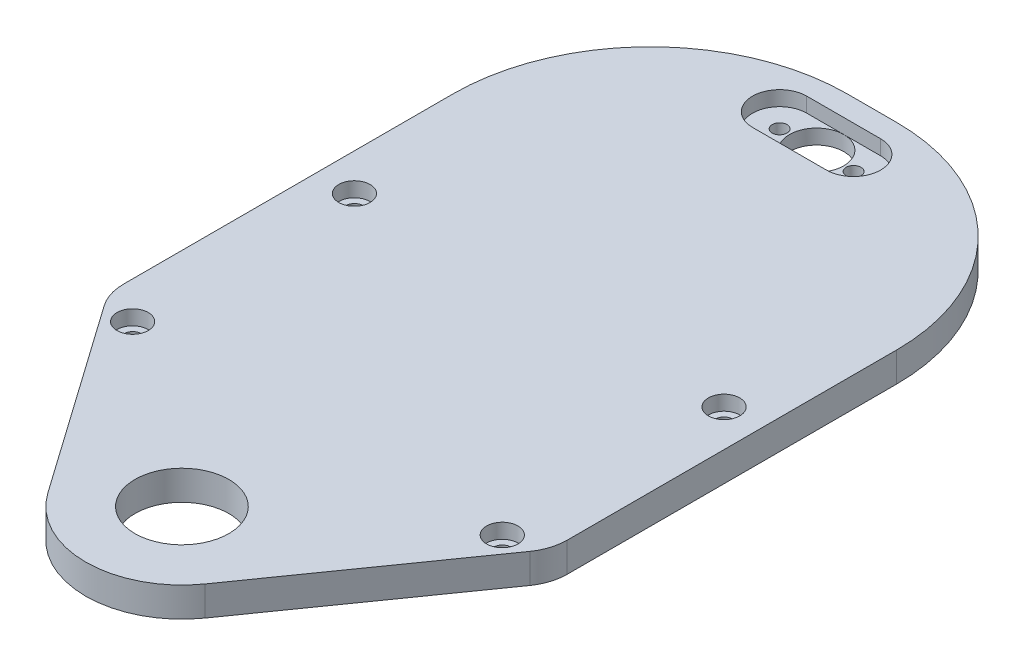
ISO-10303-21;
HEADER;
FILE_DESCRIPTION(('STEP AP214'),'2;1');
FILE_NAME('part.step','',(''),(''),'','','');
FILE_SCHEMA(('AUTOMOTIVE_DESIGN { 1 0 10303 214 1 1 1 1 }'));
ENDSEC;
DATA;
#1=APPLICATION_CONTEXT('core data for automotive mechanical design processes');
#2=APPLICATION_PROTOCOL_DEFINITION('international standard','automotive_design',2000,#1);
#3=PRODUCT_CONTEXT('',#1,'mechanical');
#4=PRODUCT('Part','Part','',(#3));
#5=PRODUCT_RELATED_PRODUCT_CATEGORY('part','',(#4));
#6=PRODUCT_DEFINITION_FORMATION('','',#4);
#7=PRODUCT_DEFINITION_CONTEXT('part definition',#1,'design');
#8=PRODUCT_DEFINITION('design','',#6,#7);
#9=PRODUCT_DEFINITION_SHAPE('','',#8);
#10=(LENGTH_UNIT() NAMED_UNIT(*) SI_UNIT(.MILLI.,.METRE.));
#11=(NAMED_UNIT(*) PLANE_ANGLE_UNIT() SI_UNIT($,.RADIAN.));
#12=(NAMED_UNIT(*) SI_UNIT($,.STERADIAN.) SOLID_ANGLE_UNIT());
#13=UNCERTAINTY_MEASURE_WITH_UNIT(LENGTH_MEASURE(1.E-05),#10,'distance_accuracy_value','');
#14=(GEOMETRIC_REPRESENTATION_CONTEXT(3) GLOBAL_UNCERTAINTY_ASSIGNED_CONTEXT((#13)) GLOBAL_UNIT_ASSIGNED_CONTEXT((#10,
#11,#12)) REPRESENTATION_CONTEXT('',''));
#15=CARTESIAN_POINT('',(0.,0.,0.));
#16=DIRECTION('',(0.,0.,1.));
#17=DIRECTION('',(1.,0.,0.));
#18=AXIS2_PLACEMENT_3D('',#15,#16,#17);
#19=CARTESIAN_POINT('',(6.27342083700379,-15.556349186104,-45.));
#20=DIRECTION('',(0.,1.,0.));
#21=DIRECTION('',(0.,0.,1.));
#22=AXIS2_PLACEMENT_3D('',#19,#20,#21);
#23=CYLINDRICAL_SURFACE('',#22,1.5);
#24=CARTESIAN_POINT('',(6.27342083700379,0.,-45.));
#25=DIRECTION('',(0.,1.,0.));
#26=DIRECTION('',(0.,0.,1.));
#27=AXIS2_PLACEMENT_3D('',#24,#25,#26);
#28=CIRCLE('',#27,1.5);
#29=CARTESIAN_POINT('',(6.27342083700379,0.,-43.5));
#30=VERTEX_POINT('',#29);
#31=EDGE_CURVE('E216',#30,#30,#28,.F.);
#32=ORIENTED_EDGE('',*,*,#31,.T.);
#33=EDGE_LOOP('',(#32));
#34=FACE_BOUND('',#33,.T.);
#35=CARTESIAN_POINT('',(6.27342083700379,3.,-45.));
#36=DIRECTION('',(0.,1.,0.));
#37=DIRECTION('',(0.,0.,1.));
#38=AXIS2_PLACEMENT_3D('',#35,#36,#37);
#39=CIRCLE('',#38,1.5);
#40=CARTESIAN_POINT('',(6.27342083700379,3.,-43.5));
#41=VERTEX_POINT('',#40);
#42=EDGE_CURVE('E202',#41,#41,#39,.F.);
#43=ORIENTED_EDGE('',*,*,#42,.F.);
#44=EDGE_LOOP('',(#43));
#45=FACE_BOUND('',#44,.T.);
#46=ADVANCED_FACE('F38',(#34,#45),#23,.F.);
#47=CARTESIAN_POINT('',(37.5,-15.556349186104,12.5));
#48=DIRECTION('',(0.,1.,0.));
#49=DIRECTION('',(0.,0.,1.));
#50=AXIS2_PLACEMENT_3D('',#47,#48,#49);
#51=CYLINDRICAL_SURFACE('',#50,1.75);
#52=CARTESIAN_POINT('',(37.5,0.,12.5));
#53=DIRECTION('',(0.,1.,0.));
#54=DIRECTION('',(0.,0.,1.));
#55=AXIS2_PLACEMENT_3D('',#52,#53,#54);
#56=CIRCLE('',#55,1.75);
#57=CARTESIAN_POINT('',(37.5,0.,14.25));
#58=VERTEX_POINT('',#57);
#59=EDGE_CURVE('E210',#58,#58,#56,.F.);
#60=ORIENTED_EDGE('',*,*,#59,.T.);
#61=EDGE_LOOP('',(#60));
#62=FACE_BOUND('',#61,.T.);
#63=CARTESIAN_POINT('',(37.5,3.,12.5));
#64=DIRECTION('',(0.,1.,0.));
#65=DIRECTION('',(0.,0.,1.));
#66=AXIS2_PLACEMENT_3D('',#63,#64,#65);
#67=CIRCLE('',#66,1.75);
#68=CARTESIAN_POINT('',(37.5,3.,14.25));
#69=VERTEX_POINT('',#68);
#70=EDGE_CURVE('E42',#69,#69,#67,.F.);
#71=ORIENTED_EDGE('',*,*,#70,.F.);
#72=EDGE_LOOP('',(#71));
#73=FACE_BOUND('',#72,.T.);
#74=ADVANCED_FACE('F316',(#62,#73),#51,.F.);
#75=CARTESIAN_POINT('',(-37.5,-15.556349186104,12.5));
#76=DIRECTION('',(0.,1.,0.));
#77=DIRECTION('',(0.,0.,1.));
#78=AXIS2_PLACEMENT_3D('',#75,#76,#77);
#79=CYLINDRICAL_SURFACE('',#78,1.75);
#80=CARTESIAN_POINT('',(-37.5,0.,12.5));
#81=DIRECTION('',(0.,1.,0.));
#82=DIRECTION('',(0.,0.,1.));
#83=AXIS2_PLACEMENT_3D('',#80,#81,#82);
#84=CIRCLE('',#83,1.75);
#85=CARTESIAN_POINT('',(-37.5,0.,14.25));
#86=VERTEX_POINT('',#85);
#87=EDGE_CURVE('E206',#86,#86,#84,.F.);
#88=ORIENTED_EDGE('',*,*,#87,.T.);
#89=EDGE_LOOP('',(#88));
#90=FACE_BOUND('',#89,.T.);
#91=CARTESIAN_POINT('',(-37.5,3.,12.5));
#92=DIRECTION('',(0.,1.,0.));
#93=DIRECTION('',(0.,0.,1.));
#94=AXIS2_PLACEMENT_3D('',#91,#92,#93);
#95=CIRCLE('',#94,1.75);
#96=CARTESIAN_POINT('',(-37.5,3.,14.25));
#97=VERTEX_POINT('',#96);
#98=EDGE_CURVE('E307',#97,#97,#95,.F.);
#99=ORIENTED_EDGE('',*,*,#98,.F.);
#100=EDGE_LOOP('',(#99));
#101=FACE_BOUND('',#100,.T.);
#102=ADVANCED_FACE('F318',(#90,#101),#79,.F.);
#103=CARTESIAN_POINT('',(-37.5,-15.556349186104,57.5));
#104=DIRECTION('',(0.,1.,0.));
#105=DIRECTION('',(0.,0.,1.));
#106=AXIS2_PLACEMENT_3D('',#103,#104,#105);
#107=CYLINDRICAL_SURFACE('',#106,1.75);
#108=CARTESIAN_POINT('',(-37.5,0.,57.5));
#109=DIRECTION('',(0.,1.,0.));
#110=DIRECTION('',(0.,0.,1.));
#111=AXIS2_PLACEMENT_3D('',#108,#109,#110);
#112=CIRCLE('',#111,1.75);
#113=CARTESIAN_POINT('',(-37.5,0.,59.25));
#114=VERTEX_POINT('',#113);
#115=EDGE_CURVE('E209',#114,#114,#112,.F.);
#116=ORIENTED_EDGE('',*,*,#115,.T.);
#117=EDGE_LOOP('',(#116));
#118=FACE_BOUND('',#117,.T.);
#119=CARTESIAN_POINT('',(-37.5,3.,57.5));
#120=DIRECTION('',(0.,1.,0.));
#121=DIRECTION('',(0.,0.,1.));
#122=AXIS2_PLACEMENT_3D('',#119,#120,#121);
#123=CIRCLE('',#122,1.75);
#124=CARTESIAN_POINT('',(-37.5,3.,59.25));
#125=VERTEX_POINT('',#124);
#126=EDGE_CURVE('E305',#125,#125,#123,.F.);
#127=ORIENTED_EDGE('',*,*,#126,.F.);
#128=EDGE_LOOP('',(#127));
#129=FACE_BOUND('',#128,.T.);
#130=ADVANCED_FACE('F325',(#118,#129),#107,.F.);
#131=CARTESIAN_POINT('',(37.5,-15.556349186104,57.5));
#132=DIRECTION('',(0.,1.,0.));
#133=DIRECTION('',(0.,0.,1.));
#134=AXIS2_PLACEMENT_3D('',#131,#132,#133);
#135=CYLINDRICAL_SURFACE('',#134,1.75);
#136=CARTESIAN_POINT('',(37.5,0.,57.5));
#137=DIRECTION('',(0.,1.,0.));
#138=DIRECTION('',(0.,0.,1.));
#139=AXIS2_PLACEMENT_3D('',#136,#137,#138);
#140=CIRCLE('',#139,1.75);
#141=CARTESIAN_POINT('',(37.5,0.,59.25));
#142=VERTEX_POINT('',#141);
#143=EDGE_CURVE('E220',#142,#142,#140,.F.);
#144=ORIENTED_EDGE('',*,*,#143,.T.);
#145=EDGE_LOOP('',(#144));
#146=FACE_BOUND('',#145,.T.);
#147=CARTESIAN_POINT('',(37.5,3.,57.5));
#148=DIRECTION('',(0.,1.,0.));
#149=DIRECTION('',(0.,0.,1.));
#150=AXIS2_PLACEMENT_3D('',#147,#148,#149);
#151=CIRCLE('',#150,1.75);
#152=CARTESIAN_POINT('',(37.5,3.,59.25));
#153=VERTEX_POINT('',#152);
#154=EDGE_CURVE('E205',#153,#153,#151,.F.);
#155=ORIENTED_EDGE('',*,*,#154,.F.);
#156=EDGE_LOOP('',(#155));
#157=FACE_BOUND('',#156,.T.);
#158=ADVANCED_FACE('F339',(#146,#157),#135,.F.);
#159=CARTESIAN_POINT('',(-1.22657916299621,-15.556349186104,-45.));
#160=DIRECTION('',(0.,1.,0.));
#161=DIRECTION('',(0.,0.,1.));
#162=AXIS2_PLACEMENT_3D('',#159,#160,#161);
#163=CYLINDRICAL_SURFACE('',#162,5.5);
#164=CARTESIAN_POINT('',(-1.22657916299621,0.,-45.));
#165=DIRECTION('',(0.,1.,0.));
#166=DIRECTION('',(0.,0.,1.));
#167=AXIS2_PLACEMENT_3D('',#164,#165,#166);
#168=CIRCLE('',#167,5.5);
#169=CARTESIAN_POINT('',(-1.22657916299621,0.,-39.5));
#170=VERTEX_POINT('',#169);
#171=EDGE_CURVE('E217',#170,#170,#168,.F.);
#172=ORIENTED_EDGE('',*,*,#171,.T.);
#173=EDGE_LOOP('',(#172));
#174=FACE_BOUND('',#173,.T.);
#175=CARTESIAN_POINT('',(-1.22657916299621,3.,-45.));
#176=DIRECTION('',(0.,1.,0.));
#177=DIRECTION('',(0.,0.,1.));
#178=AXIS2_PLACEMENT_3D('',#175,#176,#177);
#179=CIRCLE('',#178,5.5);
#180=CARTESIAN_POINT('',(-1.22657916299621,3.,-39.5));
#181=VERTEX_POINT('',#180);
#182=CARTESIAN_POINT('',(-1.22657916299621,3.,-50.5));
#183=VERTEX_POINT('',#182);
#184=EDGE_CURVE('E201',#181,#183,#179,.F.);
#185=ORIENTED_EDGE('',*,*,#184,.F.);
#186=EDGE_CURVE('E199',#183,#181,#179,.F.);
#187=ORIENTED_EDGE('',*,*,#186,.F.);
#188=EDGE_LOOP('',(#185,#187));
#189=FACE_BOUND('',#188,.T.);
#190=ADVANCED_FACE('F335',(#174,#189),#163,.F.);
#191=CARTESIAN_POINT('',(-8.7265791629962,-15.556349186104,-45.));
#192=DIRECTION('',(0.,1.,0.));
#193=DIRECTION('',(0.,0.,1.));
#194=AXIS2_PLACEMENT_3D('',#191,#192,#193);
#195=CYLINDRICAL_SURFACE('',#194,1.5);
#196=CARTESIAN_POINT('',(-8.7265791629962,0.,-45.));
#197=DIRECTION('',(0.,1.,0.));
#198=DIRECTION('',(0.,0.,1.));
#199=AXIS2_PLACEMENT_3D('',#196,#197,#198);
#200=CIRCLE('',#199,1.5);
#201=CARTESIAN_POINT('',(-8.7265791629962,0.,-43.5));
#202=VERTEX_POINT('',#201);
#203=EDGE_CURVE('E213',#202,#202,#200,.F.);
#204=ORIENTED_EDGE('',*,*,#203,.T.);
#205=EDGE_LOOP('',(#204));
#206=FACE_BOUND('',#205,.T.);
#207=CARTESIAN_POINT('',(-8.7265791629962,3.,-45.));
#208=DIRECTION('',(0.,1.,0.));
#209=DIRECTION('',(0.,0.,1.));
#210=AXIS2_PLACEMENT_3D('',#207,#208,#209);
#211=CIRCLE('',#210,1.5);
#212=CARTESIAN_POINT('',(-8.7265791629962,3.,-43.5));
#213=VERTEX_POINT('',#212);
#214=EDGE_CURVE('E198',#213,#213,#211,.F.);
#215=ORIENTED_EDGE('',*,*,#214,.F.);
#216=EDGE_LOOP('',(#215));
#217=FACE_BOUND('',#216,.T.);
#218=ADVANCED_FACE('F332',(#206,#217),#195,.F.);
#219=CARTESIAN_POINT('',(0.,6.,85.));
#220=DIRECTION('',(0.,1.,0.));
#221=DIRECTION('',(0.,0.,1.));
#222=AXIS2_PLACEMENT_3D('',#219,#220,#221);
#223=PLANE('',#222);
#224=CARTESIAN_POINT('',(-8.7265791629962,6.,-45.));
#225=DIRECTION('',(0.,1.,0.));
#226=DIRECTION('',(0.,0.,1.));
#227=AXIS2_PLACEMENT_3D('',#224,#225,#226);
#228=CIRCLE('',#227,5.5);
#229=CARTESIAN_POINT('',(-8.7265791629962,6.,-50.5));
#230=VERTEX_POINT('',#229);
#231=CARTESIAN_POINT('',(-8.7265791629962,6.,-39.5));
#232=VERTEX_POINT('',#231);
#233=EDGE_CURVE('E155',#230,#232,#228,.T.);
#234=ORIENTED_EDGE('',*,*,#233,.F.);
#235=DIRECTION('',(-1.,0.,0.));
#236=VECTOR('',#235,1.);
#237=CARTESIAN_POINT('',(-8.7265791629962,6.,-50.5));
#238=LINE('',#237,#236);
#239=CARTESIAN_POINT('',(6.27342083700379,6.,-50.5));
#240=VERTEX_POINT('',#239);
#241=EDGE_CURVE('E171',#240,#230,#238,.T.);
#242=ORIENTED_EDGE('',*,*,#241,.F.);
#243=CARTESIAN_POINT('',(6.27342083700379,6.,-45.));
#244=DIRECTION('',(0.,1.,0.));
#245=DIRECTION('',(0.,0.,1.));
#246=AXIS2_PLACEMENT_3D('',#243,#244,#245);
#247=CIRCLE('',#246,5.5);
#248=CARTESIAN_POINT('',(6.27342083700379,6.,-39.5));
#249=VERTEX_POINT('',#248);
#250=EDGE_CURVE('E157',#249,#240,#247,.T.);
#251=ORIENTED_EDGE('',*,*,#250,.F.);
#252=DIRECTION('',(1.,0.,0.));
#253=VECTOR('',#252,1.);
#254=CARTESIAN_POINT('',(6.27342083700379,6.,-39.5));
#255=LINE('',#254,#253);
#256=EDGE_CURVE('E149',#232,#249,#255,.T.);
#257=ORIENTED_EDGE('',*,*,#256,.F.);
#258=EDGE_LOOP('',(#234,#242,#251,#257));
#259=FACE_BOUND('',#258,.T.);
#260=CARTESIAN_POINT('',(-37.5,6.,57.5));
#261=DIRECTION('',(0.,1.,0.));
#262=DIRECTION('',(0.,0.,1.));
#263=AXIS2_PLACEMENT_3D('',#260,#261,#262);
#264=CIRCLE('',#263,3.175);
#265=CARTESIAN_POINT('',(-37.5,6.,60.675));
#266=VERTEX_POINT('',#265);
#267=EDGE_CURVE('E190',#266,#266,#264,.T.);
#268=ORIENTED_EDGE('',*,*,#267,.F.);
#269=EDGE_LOOP('',(#268));
#270=FACE_BOUND('',#269,.T.);
#271=CARTESIAN_POINT('',(37.5,6.,57.5));
#272=DIRECTION('',(0.,1.,0.));
#273=DIRECTION('',(0.,0.,1.));
#274=AXIS2_PLACEMENT_3D('',#271,#272,#273);
#275=CIRCLE('',#274,3.175);
#276=CARTESIAN_POINT('',(37.5,6.,60.675));
#277=VERTEX_POINT('',#276);
#278=EDGE_CURVE('E491',#277,#277,#275,.T.);
#279=ORIENTED_EDGE('',*,*,#278,.F.);
#280=EDGE_LOOP('',(#279));
#281=FACE_BOUND('',#280,.T.);
#282=CARTESIAN_POINT('',(37.5,6.,12.5));
#283=DIRECTION('',(0.,1.,0.));
#284=DIRECTION('',(0.,0.,1.));
#285=AXIS2_PLACEMENT_3D('',#282,#283,#284);
#286=CIRCLE('',#285,3.175);
#287=CARTESIAN_POINT('',(37.5,6.,15.675));
#288=VERTEX_POINT('',#287);
#289=EDGE_CURVE('E706',#288,#288,#286,.T.);
#290=ORIENTED_EDGE('',*,*,#289,.F.);
#291=EDGE_LOOP('',(#290));
#292=FACE_BOUND('',#291,.T.);
#293=CARTESIAN_POINT('',(-37.5,6.,12.5));
#294=DIRECTION('',(0.,1.,0.));
#295=DIRECTION('',(0.,0.,1.));
#296=AXIS2_PLACEMENT_3D('',#293,#294,#295);
#297=CIRCLE('',#296,3.175);
#298=CARTESIAN_POINT('',(-37.5,6.,15.675));
#299=VERTEX_POINT('',#298);
#300=EDGE_CURVE('E191',#299,#299,#297,.T.);
#301=ORIENTED_EDGE('',*,*,#300,.F.);
#302=EDGE_LOOP('',(#301));
#303=FACE_BOUND('',#302,.T.);
#304=DIRECTION('',(0.,0.,-1.));
#305=VECTOR('',#304,1.);
#306=CARTESIAN_POINT('',(45.,6.,55.));
#307=LINE('',#306,#305);
#308=CARTESIAN_POINT('',(45.,6.,51.8328796359892));
#309=VERTEX_POINT('',#308);
#310=CARTESIAN_POINT('',(45.,6.,-15.));
#311=VERTEX_POINT('',#310);
#312=EDGE_CURVE('E234',#309,#311,#307,.T.);
#313=ORIENTED_EDGE('',*,*,#312,.T.);
#314=CARTESIAN_POINT('',(4.99999999999998,6.,-15.));
#315=DIRECTION('',(0.,1.,0.));
#316=DIRECTION('',(0.,0.,1.));
#317=AXIS2_PLACEMENT_3D('',#314,#315,#316);
#318=CIRCLE('',#317,40.);
#319=CARTESIAN_POINT('',(4.99999999999997,6.,-55.));
#320=VERTEX_POINT('',#319);
#321=EDGE_CURVE('E47',#311,#320,#318,.T.);
#322=ORIENTED_EDGE('',*,*,#321,.T.);
#323=DIRECTION('',(-1.,0.,0.));
#324=VECTOR('',#323,1.);
#325=CARTESIAN_POINT('',(-45.,6.,-55.));
#326=LINE('',#325,#324);
#327=CARTESIAN_POINT('',(-5.00000000000002,6.,-55.));
#328=VERTEX_POINT('',#327);
#329=EDGE_CURVE('E237',#320,#328,#326,.T.);
#330=ORIENTED_EDGE('',*,*,#329,.T.);
#331=CARTESIAN_POINT('',(-5.00000000000001,6.,-15.));
#332=DIRECTION('',(0.,1.,0.));
#333=DIRECTION('',(0.,0.,1.));
#334=AXIS2_PLACEMENT_3D('',#331,#332,#333);
#335=CIRCLE('',#334,40.);
#336=CARTESIAN_POINT('',(-45.,6.,-15.));
#337=VERTEX_POINT('',#336);
#338=EDGE_CURVE('E63',#328,#337,#335,.T.);
#339=ORIENTED_EDGE('',*,*,#338,.T.);
#340=DIRECTION('',(0.,0.,1.));
#341=VECTOR('',#340,1.);
#342=CARTESIAN_POINT('',(-45.,6.,55.));
#343=LINE('',#342,#341);
#344=CARTESIAN_POINT('',(-45.,6.,51.8328796359892));
#345=VERTEX_POINT('',#344);
#346=EDGE_CURVE('E240',#337,#345,#343,.T.);
#347=ORIENTED_EDGE('',*,*,#346,.T.);
#348=CARTESIAN_POINT('',(-35.,6.,51.8328796359892));
#349=DIRECTION('',(0.,1.,0.));
#350=DIRECTION('',(0.,0.,1.));
#351=AXIS2_PLACEMENT_3D('',#348,#349,#350);
#352=CIRCLE('',#351,10.);
#353=CARTESIAN_POINT('',(-43.1767532460287,6.,57.5896761716989));
#354=VERTEX_POINT('',#353);
#355=EDGE_CURVE('E278',#345,#354,#352,.T.);
#356=ORIENTED_EDGE('',*,*,#355,.T.);
#357=DIRECTION('',(0.575679653570971,0.,0.817675324602869));
#358=VECTOR('',#357,1.);
#359=CARTESIAN_POINT('',(-45.,6.,55.));
#360=LINE('',#359,#358);
#361=CARTESIAN_POINT('',(-15.965110712871,6.,96.2401452359732));
#362=VERTEX_POINT('',#361);
#363=EDGE_CURVE('E242',#354,#362,#360,.T.);
#364=ORIENTED_EDGE('',*,*,#363,.T.);
#365=CARTESIAN_POINT('',(0.,6.,85.));
#366=DIRECTION('',(0.,1.,0.));
#367=DIRECTION('',(0.,0.,1.));
#368=AXIS2_PLACEMENT_3D('',#365,#366,#367);
#369=CIRCLE('',#368,19.525);
#370=CARTESIAN_POINT('',(15.965110712871,6.,96.2401452359732));
#371=VERTEX_POINT('',#370);
#372=EDGE_CURVE('E244',#362,#371,#369,.T.);
#373=ORIENTED_EDGE('',*,*,#372,.T.);
#374=DIRECTION('',(0.57567965357097,0.,-0.81767532460287));
#375=VECTOR('',#374,1.);
#376=CARTESIAN_POINT('',(45.,6.,55.));
#377=LINE('',#376,#375);
#378=CARTESIAN_POINT('',(43.1767532460287,6.,57.5896761716989));
#379=VERTEX_POINT('',#378);
#380=EDGE_CURVE('E246',#371,#379,#377,.T.);
#381=ORIENTED_EDGE('',*,*,#380,.T.);
#382=CARTESIAN_POINT('',(35.,6.,51.8328796359892));
#383=DIRECTION('',(0.,1.,0.));
#384=DIRECTION('',(0.,0.,1.));
#385=AXIS2_PLACEMENT_3D('',#382,#383,#384);
#386=CIRCLE('',#385,10.);
#387=EDGE_CURVE('E280',#379,#309,#386,.T.);
#388=ORIENTED_EDGE('',*,*,#387,.T.);
#389=EDGE_LOOP('',(#313,#322,#330,#339,#347,#356,#364,#373,#381,#388));
#390=FACE_BOUND('',#389,.T.);
#391=CARTESIAN_POINT('',(0.,6.,85.));
#392=DIRECTION('',(0.,1.,0.));
#393=DIRECTION('',(0.,0.,1.));
#394=AXIS2_PLACEMENT_3D('',#391,#392,#393);
#395=CIRCLE('',#394,9.525);
#396=CARTESIAN_POINT('',(0.,6.,94.525));
#397=VERTEX_POINT('',#396);
#398=EDGE_CURVE('E228',#397,#397,#395,.T.);
#399=ORIENTED_EDGE('',*,*,#398,.F.);
#400=EDGE_LOOP('',(#399));
#401=FACE_BOUND('',#400,.T.);
#402=ADVANCED_FACE('F151',(#259,#270,#281,#292,#303,#390,#401),#223,.T.);
#403=CARTESIAN_POINT('',(0.,0.,85.));
#404=DIRECTION('',(0.,1.,0.));
#405=DIRECTION('',(0.,0.,1.));
#406=AXIS2_PLACEMENT_3D('',#403,#404,#405);
#407=PLANE('',#406);
#408=ORIENTED_EDGE('',*,*,#203,.F.);
#409=EDGE_LOOP('',(#408));
#410=FACE_BOUND('',#409,.T.);
#411=ORIENTED_EDGE('',*,*,#171,.F.);
#412=EDGE_LOOP('',(#411));
#413=FACE_BOUND('',#412,.T.);
#414=ORIENTED_EDGE('',*,*,#143,.F.);
#415=EDGE_LOOP('',(#414));
#416=FACE_BOUND('',#415,.T.);
#417=ORIENTED_EDGE('',*,*,#115,.F.);
#418=EDGE_LOOP('',(#417));
#419=FACE_BOUND('',#418,.T.);
#420=ORIENTED_EDGE('',*,*,#87,.F.);
#421=EDGE_LOOP('',(#420));
#422=FACE_BOUND('',#421,.T.);
#423=ORIENTED_EDGE('',*,*,#59,.F.);
#424=EDGE_LOOP('',(#423));
#425=FACE_BOUND('',#424,.T.);
#426=ORIENTED_EDGE('',*,*,#31,.F.);
#427=EDGE_LOOP('',(#426));
#428=FACE_BOUND('',#427,.T.);
#429=DIRECTION('',(-1.,0.,0.));
#430=VECTOR('',#429,1.);
#431=CARTESIAN_POINT('',(-45.,0.,-55.));
#432=LINE('',#431,#430);
#433=CARTESIAN_POINT('',(4.99999999999997,0.,-55.));
#434=VERTEX_POINT('',#433);
#435=CARTESIAN_POINT('',(-5.00000000000002,0.,-55.));
#436=VERTEX_POINT('',#435);
#437=EDGE_CURVE('E252',#434,#436,#432,.T.);
#438=ORIENTED_EDGE('',*,*,#437,.F.);
#439=CARTESIAN_POINT('',(4.99999999999998,0.,-15.));
#440=DIRECTION('',(0.,1.,0.));
#441=DIRECTION('',(0.,0.,1.));
#442=AXIS2_PLACEMENT_3D('',#439,#440,#441);
#443=CIRCLE('',#442,40.);
#444=CARTESIAN_POINT('',(45.,0.,-15.));
#445=VERTEX_POINT('',#444);
#446=EDGE_CURVE('E295',#434,#445,#443,.F.);
#447=ORIENTED_EDGE('',*,*,#446,.T.);
#448=DIRECTION('',(0.,0.,-1.));
#449=VECTOR('',#448,1.);
#450=CARTESIAN_POINT('',(45.,0.,55.));
#451=LINE('',#450,#449);
#452=CARTESIAN_POINT('',(45.,0.,51.8328796359892));
#453=VERTEX_POINT('',#452);
#454=EDGE_CURVE('E231',#453,#445,#451,.T.);
#455=ORIENTED_EDGE('',*,*,#454,.F.);
#456=CARTESIAN_POINT('',(35.,0.,51.8328796359892));
#457=DIRECTION('',(0.,1.,0.));
#458=DIRECTION('',(0.,0.,1.));
#459=AXIS2_PLACEMENT_3D('',#456,#457,#458);
#460=CIRCLE('',#459,10.);
#461=CARTESIAN_POINT('',(43.1767532460287,0.,57.5896761716989));
#462=VERTEX_POINT('',#461);
#463=EDGE_CURVE('E274',#453,#462,#460,.F.);
#464=ORIENTED_EDGE('',*,*,#463,.T.);
#465=DIRECTION('',(0.57567965357097,0.,-0.81767532460287));
#466=VECTOR('',#465,1.);
#467=CARTESIAN_POINT('',(45.,0.,55.));
#468=LINE('',#467,#466);
#469=CARTESIAN_POINT('',(15.965110712871,0.,96.2401452359732));
#470=VERTEX_POINT('',#469);
#471=EDGE_CURVE('E238',#470,#462,#468,.T.);
#472=ORIENTED_EDGE('',*,*,#471,.F.);
#473=CARTESIAN_POINT('',(0.,0.,85.));
#474=DIRECTION('',(0.,1.,0.));
#475=DIRECTION('',(0.,0.,1.));
#476=AXIS2_PLACEMENT_3D('',#473,#474,#475);
#477=CIRCLE('',#476,19.525);
#478=CARTESIAN_POINT('',(-15.965110712871,0.,96.2401452359732));
#479=VERTEX_POINT('',#478);
#480=EDGE_CURVE('E259',#479,#470,#477,.T.);
#481=ORIENTED_EDGE('',*,*,#480,.F.);
#482=DIRECTION('',(0.575679653570971,0.,0.817675324602869));
#483=VECTOR('',#482,1.);
#484=CARTESIAN_POINT('',(-45.,0.,55.));
#485=LINE('',#484,#483);
#486=CARTESIAN_POINT('',(-43.1767532460287,0.,57.5896761716989));
#487=VERTEX_POINT('',#486);
#488=EDGE_CURVE('E257',#487,#479,#485,.T.);
#489=ORIENTED_EDGE('',*,*,#488,.F.);
#490=CARTESIAN_POINT('',(-35.,0.,51.8328796359892));
#491=DIRECTION('',(0.,1.,0.));
#492=DIRECTION('',(0.,0.,1.));
#493=AXIS2_PLACEMENT_3D('',#490,#491,#492);
#494=CIRCLE('',#493,10.);
#495=CARTESIAN_POINT('',(-45.,0.,51.8328796359892));
#496=VERTEX_POINT('',#495);
#497=EDGE_CURVE('E271',#487,#496,#494,.F.);
#498=ORIENTED_EDGE('',*,*,#497,.T.);
#499=DIRECTION('',(0.,0.,1.));
#500=VECTOR('',#499,1.);
#501=CARTESIAN_POINT('',(-45.,0.,55.));
#502=LINE('',#501,#500);
#503=CARTESIAN_POINT('',(-45.,0.,-15.));
#504=VERTEX_POINT('',#503);
#505=EDGE_CURVE('E255',#504,#496,#502,.T.);
#506=ORIENTED_EDGE('',*,*,#505,.F.);
#507=CARTESIAN_POINT('',(-5.00000000000001,0.,-15.));
#508=DIRECTION('',(0.,1.,0.));
#509=DIRECTION('',(0.,0.,1.));
#510=AXIS2_PLACEMENT_3D('',#507,#508,#509);
#511=CIRCLE('',#510,40.);
#512=EDGE_CURVE('E293',#504,#436,#511,.F.);
#513=ORIENTED_EDGE('',*,*,#512,.T.);
#514=EDGE_LOOP('',(#438,#447,#455,#464,#472,#481,#489,#498,#506,#513));
#515=FACE_BOUND('',#514,.T.);
#516=CARTESIAN_POINT('',(0.,0.,85.));
#517=DIRECTION('',(0.,1.,0.));
#518=DIRECTION('',(0.,0.,1.));
#519=AXIS2_PLACEMENT_3D('',#516,#517,#518);
#520=CIRCLE('',#519,9.525);
#521=CARTESIAN_POINT('',(0.,0.,94.525));
#522=VERTEX_POINT('',#521);
#523=EDGE_CURVE('E227',#522,#522,#520,.T.);
#524=ORIENTED_EDGE('',*,*,#523,.T.);
#525=EDGE_LOOP('',(#524));
#526=FACE_BOUND('',#525,.T.);
#527=ADVANCED_FACE('F355',(#410,#413,#416,#419,#422,#425,#428,#515,#526),#407,.F.);
#528=CARTESIAN_POINT('',(45.,6.,55.));
#529=DIRECTION('',(-1.,0.,0.));
#530=DIRECTION('',(0.,0.,1.));
#531=AXIS2_PLACEMENT_3D('',#528,#529,#530);
#532=PLANE('',#531);
#533=ORIENTED_EDGE('',*,*,#454,.T.);
#534=DIRECTION('',(0.,-1.,0.));
#535=VECTOR('',#534,1.);
#536=CARTESIAN_POINT('',(45.,6.,-15.));
#537=LINE('',#536,#535);
#538=EDGE_CURVE('E297',#445,#311,#537,.F.);
#539=ORIENTED_EDGE('',*,*,#538,.T.);
#540=ORIENTED_EDGE('',*,*,#312,.F.);
#541=DIRECTION('',(0.,-1.,0.));
#542=VECTOR('',#541,1.);
#543=CARTESIAN_POINT('',(45.,6.,51.8328796359892));
#544=LINE('',#543,#542);
#545=EDGE_CURVE('E268',#309,#453,#544,.T.);
#546=ORIENTED_EDGE('',*,*,#545,.T.);
#547=EDGE_LOOP('',(#533,#539,#540,#546));
#548=FACE_BOUND('',#547,.T.);
#549=ADVANCED_FACE('F358',(#548),#532,.F.);
#550=CARTESIAN_POINT('',(-45.,6.,-55.));
#551=DIRECTION('',(0.,0.,1.));
#552=DIRECTION('',(1.,0.,0.));
#553=AXIS2_PLACEMENT_3D('',#550,#551,#552);
#554=PLANE('',#553);
#555=ORIENTED_EDGE('',*,*,#329,.F.);
#556=DIRECTION('',(0.,-1.,0.));
#557=VECTOR('',#556,1.);
#558=CARTESIAN_POINT('',(4.99999999999998,6.,-55.));
#559=LINE('',#558,#557);
#560=EDGE_CURVE('E290',#320,#434,#559,.T.);
#561=ORIENTED_EDGE('',*,*,#560,.T.);
#562=ORIENTED_EDGE('',*,*,#437,.T.);
#563=DIRECTION('',(0.,-1.,0.));
#564=VECTOR('',#563,1.);
#565=CARTESIAN_POINT('',(-5.00000000000001,6.,-55.));
#566=LINE('',#565,#564);
#567=EDGE_CURVE('E288',#436,#328,#566,.F.);
#568=ORIENTED_EDGE('',*,*,#567,.T.);
#569=EDGE_LOOP('',(#555,#561,#562,#568));
#570=FACE_BOUND('',#569,.T.);
#571=ADVANCED_FACE('F374',(#570),#554,.F.);
#572=CARTESIAN_POINT('',(-45.,6.,55.));
#573=DIRECTION('',(1.,0.,0.));
#574=DIRECTION('',(0.,0.,-1.));
#575=AXIS2_PLACEMENT_3D('',#572,#573,#574);
#576=PLANE('',#575);
#577=ORIENTED_EDGE('',*,*,#346,.F.);
#578=DIRECTION('',(0.,-1.,0.));
#579=VECTOR('',#578,1.);
#580=CARTESIAN_POINT('',(-45.,6.,-15.));
#581=LINE('',#580,#579);
#582=EDGE_CURVE('E12',#337,#504,#581,.T.);
#583=ORIENTED_EDGE('',*,*,#582,.T.);
#584=ORIENTED_EDGE('',*,*,#505,.T.);
#585=DIRECTION('',(0.,-1.,0.));
#586=VECTOR('',#585,1.);
#587=CARTESIAN_POINT('',(-45.,6.,51.8328796359892));
#588=LINE('',#587,#586);
#589=EDGE_CURVE('E285',#496,#345,#588,.F.);
#590=ORIENTED_EDGE('',*,*,#589,.T.);
#591=EDGE_LOOP('',(#577,#583,#584,#590));
#592=FACE_BOUND('',#591,.T.);
#593=ADVANCED_FACE('F370',(#592),#576,.F.);
#594=CARTESIAN_POINT('',(-45.,6.,55.));
#595=DIRECTION('',(0.817675324602869,0.,-0.575679653570971));
#596=DIRECTION('',(-0.575679653570971,0.,-0.817675324602869));
#597=AXIS2_PLACEMENT_3D('',#594,#595,#596);
#598=PLANE('',#597);
#599=ORIENTED_EDGE('',*,*,#363,.F.);
#600=DIRECTION('',(0.,-1.,0.));
#601=VECTOR('',#600,1.);
#602=CARTESIAN_POINT('',(-43.1767532460287,6.,57.5896761716989));
#603=LINE('',#602,#601);
#604=EDGE_CURVE('E282',#354,#487,#603,.T.);
#605=ORIENTED_EDGE('',*,*,#604,.T.);
#606=ORIENTED_EDGE('',*,*,#488,.T.);
#607=DIRECTION('',(0.,-1.,0.));
#608=VECTOR('',#607,1.);
#609=CARTESIAN_POINT('',(-15.965110712871,6.,96.2401452359732));
#610=LINE('',#609,#608);
#611=EDGE_CURVE('E265',#362,#479,#610,.T.);
#612=ORIENTED_EDGE('',*,*,#611,.F.);
#613=EDGE_LOOP('',(#599,#605,#606,#612));
#614=FACE_BOUND('',#613,.T.);
#615=ADVANCED_FACE('F366',(#614),#598,.F.);
#616=CARTESIAN_POINT('',(0.,6.,85.));
#617=DIRECTION('',(0.,-1.,0.));
#618=DIRECTION('',(0.,0.,-1.));
#619=AXIS2_PLACEMENT_3D('',#616,#617,#618);
#620=CYLINDRICAL_SURFACE('',#619,19.525);
#621=ORIENTED_EDGE('',*,*,#480,.T.);
#622=DIRECTION('',(0.,-1.,0.));
#623=VECTOR('',#622,1.);
#624=CARTESIAN_POINT('',(15.965110712871,6.,96.2401452359732));
#625=LINE('',#624,#623);
#626=EDGE_CURVE('E249',#371,#470,#625,.T.);
#627=ORIENTED_EDGE('',*,*,#626,.F.);
#628=ORIENTED_EDGE('',*,*,#372,.F.);
#629=ORIENTED_EDGE('',*,*,#611,.T.);
#630=EDGE_LOOP('',(#621,#627,#628,#629));
#631=FACE_BOUND('',#630,.T.);
#632=ADVANCED_FACE('F362',(#631),#620,.T.);
#633=CARTESIAN_POINT('',(45.,6.,55.));
#634=DIRECTION('',(-0.817675324602869,0.,-0.57567965357097));
#635=DIRECTION('',(-0.57567965357097,0.,0.81767532460287));
#636=AXIS2_PLACEMENT_3D('',#633,#634,#635);
#637=PLANE('',#636);
#638=ORIENTED_EDGE('',*,*,#471,.T.);
#639=DIRECTION('',(0.,-1.,0.));
#640=VECTOR('',#639,1.);
#641=CARTESIAN_POINT('',(43.1767532460287,6.,57.5896761716989));
#642=LINE('',#641,#640);
#643=EDGE_CURVE('E276',#462,#379,#642,.F.);
#644=ORIENTED_EDGE('',*,*,#643,.T.);
#645=ORIENTED_EDGE('',*,*,#380,.F.);
#646=ORIENTED_EDGE('',*,*,#626,.T.);
#647=EDGE_LOOP('',(#638,#644,#645,#646));
#648=FACE_BOUND('',#647,.T.);
#649=ADVANCED_FACE('F351',(#648),#637,.F.);
#650=CARTESIAN_POINT('',(0.,6.,85.));
#651=DIRECTION('',(0.,-1.,0.));
#652=DIRECTION('',(0.,0.,-1.));
#653=AXIS2_PLACEMENT_3D('',#650,#651,#652);
#654=CYLINDRICAL_SURFACE('',#653,9.525);
#655=ORIENTED_EDGE('',*,*,#398,.T.);
#656=EDGE_LOOP('',(#655));
#657=FACE_BOUND('',#656,.T.);
#658=ORIENTED_EDGE('',*,*,#523,.F.);
#659=EDGE_LOOP('',(#658));
#660=FACE_BOUND('',#659,.T.);
#661=ADVANCED_FACE('F347',(#657,#660),#654,.F.);
#662=CARTESIAN_POINT('',(35.,6.,51.8328796359892));
#663=DIRECTION('',(0.,-1.,0.));
#664=DIRECTION('',(0.,0.,-1.));
#665=AXIS2_PLACEMENT_3D('',#662,#663,#664);
#666=CYLINDRICAL_SURFACE('',#665,10.);
#667=ORIENTED_EDGE('',*,*,#387,.F.);
#668=ORIENTED_EDGE('',*,*,#643,.F.);
#669=ORIENTED_EDGE('',*,*,#463,.F.);
#670=ORIENTED_EDGE('',*,*,#545,.F.);
#671=EDGE_LOOP('',(#667,#668,#669,#670));
#672=FACE_BOUND('',#671,.T.);
#673=ADVANCED_FACE('F350',(#672),#666,.T.);
#674=CARTESIAN_POINT('',(-35.,6.,51.8328796359892));
#675=DIRECTION('',(0.,-1.,0.));
#676=DIRECTION('',(0.,0.,-1.));
#677=AXIS2_PLACEMENT_3D('',#674,#675,#676);
#678=CYLINDRICAL_SURFACE('',#677,10.);
#679=ORIENTED_EDGE('',*,*,#355,.F.);
#680=ORIENTED_EDGE('',*,*,#589,.F.);
#681=ORIENTED_EDGE('',*,*,#497,.F.);
#682=ORIENTED_EDGE('',*,*,#604,.F.);
#683=EDGE_LOOP('',(#679,#680,#681,#682));
#684=FACE_BOUND('',#683,.T.);
#685=ADVANCED_FACE('F384',(#684),#678,.T.);
#686=CARTESIAN_POINT('',(4.99999999999998,6.,-15.));
#687=DIRECTION('',(0.,-1.,0.));
#688=DIRECTION('',(0.,0.,-1.));
#689=AXIS2_PLACEMENT_3D('',#686,#687,#688);
#690=CYLINDRICAL_SURFACE('',#689,40.);
#691=ORIENTED_EDGE('',*,*,#321,.F.);
#692=ORIENTED_EDGE('',*,*,#538,.F.);
#693=ORIENTED_EDGE('',*,*,#446,.F.);
#694=ORIENTED_EDGE('',*,*,#560,.F.);
#695=EDGE_LOOP('',(#691,#692,#693,#694));
#696=FACE_BOUND('',#695,.T.);
#697=ADVANCED_FACE('F387',(#696),#690,.T.);
#698=CARTESIAN_POINT('',(-5.00000000000001,6.,-15.));
#699=DIRECTION('',(0.,-1.,0.));
#700=DIRECTION('',(0.,0.,-1.));
#701=AXIS2_PLACEMENT_3D('',#698,#699,#700);
#702=CYLINDRICAL_SURFACE('',#701,40.);
#703=ORIENTED_EDGE('',*,*,#338,.F.);
#704=ORIENTED_EDGE('',*,*,#567,.F.);
#705=ORIENTED_EDGE('',*,*,#512,.F.);
#706=ORIENTED_EDGE('',*,*,#582,.F.);
#707=EDGE_LOOP('',(#703,#704,#705,#706));
#708=FACE_BOUND('',#707,.T.);
#709=ADVANCED_FACE('F40',(#708),#702,.T.);
#710=CARTESIAN_POINT('',(-8.7265791629962,-28.2311884269862,-50.5));
#711=DIRECTION('',(0.,0.,-1.));
#712=DIRECTION('',(-1.,0.,0.));
#713=AXIS2_PLACEMENT_3D('',#710,#711,#712);
#714=PLANE('',#713);
#715=ORIENTED_EDGE('',*,*,#241,.T.);
#716=DIRECTION('',(0.,1.,0.));
#717=VECTOR('',#716,1.);
#718=CARTESIAN_POINT('',(-8.7265791629962,-28.2311884269862,-50.5));
#719=LINE('',#718,#717);
#720=CARTESIAN_POINT('',(-8.7265791629962,3.,-50.5));
#721=VERTEX_POINT('',#720);
#722=EDGE_CURVE('E175',#721,#230,#719,.T.);
#723=ORIENTED_EDGE('',*,*,#722,.F.);
#724=DIRECTION('',(1.,0.,0.));
#725=VECTOR('',#724,1.);
#726=CARTESIAN_POINT('',(-8.7265791629962,3.,-50.5));
#727=LINE('',#726,#725);
#728=EDGE_CURVE('E55',#721,#183,#727,.T.);
#729=ORIENTED_EDGE('',*,*,#728,.T.);
#730=CARTESIAN_POINT('',(6.27342083700379,3.,-50.5));
#731=VERTEX_POINT('',#730);
#732=EDGE_CURVE('E497',#183,#731,#727,.T.);
#733=ORIENTED_EDGE('',*,*,#732,.T.);
#734=DIRECTION('',(0.,1.,0.));
#735=VECTOR('',#734,1.);
#736=CARTESIAN_POINT('',(6.27342083700379,-28.2311884269862,-50.5));
#737=LINE('',#736,#735);
#738=EDGE_CURVE('E185',#731,#240,#737,.T.);
#739=ORIENTED_EDGE('',*,*,#738,.T.);
#740=EDGE_LOOP('',(#715,#723,#729,#733,#739));
#741=FACE_BOUND('',#740,.T.);
#742=ADVANCED_FACE('F394',(#741),#714,.F.);
#743=CARTESIAN_POINT('',(6.27342083700379,-28.2311884269862,-39.5));
#744=DIRECTION('',(0.,0.,1.));
#745=DIRECTION('',(1.,0.,0.));
#746=AXIS2_PLACEMENT_3D('',#743,#744,#745);
#747=PLANE('',#746);
#748=ORIENTED_EDGE('',*,*,#256,.T.);
#749=DIRECTION('',(0.,1.,0.));
#750=VECTOR('',#749,1.);
#751=CARTESIAN_POINT('',(6.27342083700379,-28.2311884269862,-39.5));
#752=LINE('',#751,#750);
#753=CARTESIAN_POINT('',(6.27342083700379,3.,-39.5));
#754=VERTEX_POINT('',#753);
#755=EDGE_CURVE('E170',#754,#249,#752,.T.);
#756=ORIENTED_EDGE('',*,*,#755,.F.);
#757=DIRECTION('',(-1.,0.,0.));
#758=VECTOR('',#757,1.);
#759=CARTESIAN_POINT('',(6.27342083700379,3.,-39.5));
#760=LINE('',#759,#758);
#761=EDGE_CURVE('E188',#754,#181,#760,.T.);
#762=ORIENTED_EDGE('',*,*,#761,.T.);
#763=CARTESIAN_POINT('',(-8.7265791629962,3.,-39.5));
#764=VERTEX_POINT('',#763);
#765=EDGE_CURVE('E167',#181,#764,#760,.T.);
#766=ORIENTED_EDGE('',*,*,#765,.T.);
#767=DIRECTION('',(0.,1.,0.));
#768=VECTOR('',#767,1.);
#769=CARTESIAN_POINT('',(-8.7265791629962,-28.2311884269862,-39.5));
#770=LINE('',#769,#768);
#771=EDGE_CURVE('E163',#764,#232,#770,.T.);
#772=ORIENTED_EDGE('',*,*,#771,.T.);
#773=EDGE_LOOP('',(#748,#756,#762,#766,#772));
#774=FACE_BOUND('',#773,.T.);
#775=ADVANCED_FACE('F164',(#774),#747,.F.);
#776=CARTESIAN_POINT('',(0.,3.,85.));
#777=DIRECTION('',(0.,1.,0.));
#778=DIRECTION('',(0.,0.,1.));
#779=AXIS2_PLACEMENT_3D('',#776,#777,#778);
#780=PLANE('',#779);
#781=ORIENTED_EDGE('',*,*,#186,.T.);
#782=ORIENTED_EDGE('',*,*,#761,.F.);
#783=CARTESIAN_POINT('',(6.27342083700379,3.,-45.));
#784=DIRECTION('',(0.,1.,0.));
#785=DIRECTION('',(0.,0.,1.));
#786=AXIS2_PLACEMENT_3D('',#783,#784,#785);
#787=CIRCLE('',#786,5.5);
#788=EDGE_CURVE('E184',#731,#754,#787,.F.);
#789=ORIENTED_EDGE('',*,*,#788,.F.);
#790=ORIENTED_EDGE('',*,*,#732,.F.);
#791=EDGE_LOOP('',(#781,#782,#789,#790));
#792=FACE_BOUND('',#791,.T.);
#793=ORIENTED_EDGE('',*,*,#42,.T.);
#794=EDGE_LOOP('',(#793));
#795=FACE_BOUND('',#794,.T.);
#796=ADVANCED_FACE('F433',(#792,#795),#780,.T.);
#797=ORIENTED_EDGE('',*,*,#214,.T.);
#798=EDGE_LOOP('',(#797));
#799=FACE_BOUND('',#798,.T.);
#800=ORIENTED_EDGE('',*,*,#184,.T.);
#801=ORIENTED_EDGE('',*,*,#728,.F.);
#802=CARTESIAN_POINT('',(-8.7265791629962,3.,-45.));
#803=DIRECTION('',(0.,1.,0.));
#804=DIRECTION('',(0.,0.,1.));
#805=AXIS2_PLACEMENT_3D('',#802,#803,#804);
#806=CIRCLE('',#805,5.5);
#807=EDGE_CURVE('E178',#764,#721,#806,.F.);
#808=ORIENTED_EDGE('',*,*,#807,.F.);
#809=ORIENTED_EDGE('',*,*,#765,.F.);
#810=EDGE_LOOP('',(#800,#801,#808,#809));
#811=FACE_BOUND('',#810,.T.);
#812=ADVANCED_FACE('F445',(#799,#811),#780,.T.);
#813=CARTESIAN_POINT('',(-8.7265791629962,-28.2311884269862,-45.));
#814=DIRECTION('',(0.,1.,0.));
#815=DIRECTION('',(0.,0.,1.));
#816=AXIS2_PLACEMENT_3D('',#813,#814,#815);
#817=CYLINDRICAL_SURFACE('',#816,5.5);
#818=ORIENTED_EDGE('',*,*,#807,.T.);
#819=ORIENTED_EDGE('',*,*,#722,.T.);
#820=ORIENTED_EDGE('',*,*,#233,.T.);
#821=ORIENTED_EDGE('',*,*,#771,.F.);
#822=EDGE_LOOP('',(#818,#819,#820,#821));
#823=FACE_BOUND('',#822,.T.);
#824=ADVANCED_FACE('F174',(#823),#817,.F.);
#825=CARTESIAN_POINT('',(6.27342083700379,-28.2311884269862,-45.));
#826=DIRECTION('',(0.,1.,0.));
#827=DIRECTION('',(0.,0.,1.));
#828=AXIS2_PLACEMENT_3D('',#825,#826,#827);
#829=CYLINDRICAL_SURFACE('',#828,5.5);
#830=ORIENTED_EDGE('',*,*,#788,.T.);
#831=ORIENTED_EDGE('',*,*,#755,.T.);
#832=ORIENTED_EDGE('',*,*,#250,.T.);
#833=ORIENTED_EDGE('',*,*,#738,.F.);
#834=EDGE_LOOP('',(#830,#831,#832,#833));
#835=FACE_BOUND('',#834,.T.);
#836=ADVANCED_FACE('F438',(#835),#829,.F.);
#837=CARTESIAN_POINT('',(0.,3.,85.));
#838=DIRECTION('',(0.,1.,0.));
#839=DIRECTION('',(0.,0.,1.));
#840=AXIS2_PLACEMENT_3D('',#837,#838,#839);
#841=PLANE('',#840);
#842=CARTESIAN_POINT('',(37.5,3.,57.5));
#843=DIRECTION('',(0.,1.,0.));
#844=DIRECTION('',(0.,0.,1.));
#845=AXIS2_PLACEMENT_3D('',#842,#843,#844);
#846=CIRCLE('',#845,3.175);
#847=CARTESIAN_POINT('',(37.5,3.,60.675));
#848=VERTEX_POINT('',#847);
#849=EDGE_CURVE('E494',#848,#848,#846,.F.);
#850=ORIENTED_EDGE('',*,*,#849,.F.);
#851=EDGE_LOOP('',(#850));
#852=FACE_BOUND('',#851,.T.);
#853=ORIENTED_EDGE('',*,*,#154,.T.);
#854=EDGE_LOOP('',(#853));
#855=FACE_BOUND('',#854,.T.);
#856=ADVANCED_FACE('F440',(#852,#855),#841,.T.);
#857=CARTESIAN_POINT('',(37.5,-28.2311884269862,57.5));
#858=DIRECTION('',(0.,1.,0.));
#859=DIRECTION('',(0.,0.,1.));
#860=AXIS2_PLACEMENT_3D('',#857,#858,#859);
#861=CYLINDRICAL_SURFACE('',#860,3.175);
#862=ORIENTED_EDGE('',*,*,#849,.T.);
#863=EDGE_LOOP('',(#862));
#864=FACE_BOUND('',#863,.T.);
#865=ORIENTED_EDGE('',*,*,#278,.T.);
#866=EDGE_LOOP('',(#865));
#867=FACE_BOUND('',#866,.T.);
#868=ADVANCED_FACE('F472',(#864,#867),#861,.F.);
#869=CARTESIAN_POINT('',(0.,3.,85.));
#870=DIRECTION('',(0.,1.,0.));
#871=DIRECTION('',(0.,0.,1.));
#872=AXIS2_PLACEMENT_3D('',#869,#870,#871);
#873=PLANE('',#872);
#874=CARTESIAN_POINT('',(-37.5,3.,57.5));
#875=DIRECTION('',(0.,1.,0.));
#876=DIRECTION('',(0.,0.,1.));
#877=AXIS2_PLACEMENT_3D('',#874,#875,#876);
#878=CIRCLE('',#877,3.175);
#879=CARTESIAN_POINT('',(-37.5,3.,60.675));
#880=VERTEX_POINT('',#879);
#881=EDGE_CURVE('E487',#880,#880,#878,.F.);
#882=ORIENTED_EDGE('',*,*,#881,.F.);
#883=EDGE_LOOP('',(#882));
#884=FACE_BOUND('',#883,.T.);
#885=ORIENTED_EDGE('',*,*,#126,.T.);
#886=EDGE_LOOP('',(#885));
#887=FACE_BOUND('',#886,.T.);
#888=ADVANCED_FACE('F476',(#884,#887),#873,.T.);
#889=CARTESIAN_POINT('',(-37.5,-28.2311884269862,57.5));
#890=DIRECTION('',(0.,1.,0.));
#891=DIRECTION('',(0.,0.,1.));
#892=AXIS2_PLACEMENT_3D('',#889,#890,#891);
#893=CYLINDRICAL_SURFACE('',#892,3.175);
#894=ORIENTED_EDGE('',*,*,#881,.T.);
#895=EDGE_LOOP('',(#894));
#896=FACE_BOUND('',#895,.T.);
#897=ORIENTED_EDGE('',*,*,#267,.T.);
#898=EDGE_LOOP('',(#897));
#899=FACE_BOUND('',#898,.T.);
#900=ADVANCED_FACE('F449',(#896,#899),#893,.F.);
#901=CARTESIAN_POINT('',(0.,3.,85.));
#902=DIRECTION('',(0.,1.,0.));
#903=DIRECTION('',(0.,0.,1.));
#904=AXIS2_PLACEMENT_3D('',#901,#902,#903);
#905=PLANE('',#904);
#906=CARTESIAN_POINT('',(-37.5,3.,12.5));
#907=DIRECTION('',(0.,1.,0.));
#908=DIRECTION('',(0.,0.,1.));
#909=AXIS2_PLACEMENT_3D('',#906,#907,#908);
#910=CIRCLE('',#909,3.175);
#911=CARTESIAN_POINT('',(-37.5,3.,15.675));
#912=VERTEX_POINT('',#911);
#913=EDGE_CURVE('E194',#912,#912,#910,.F.);
#914=ORIENTED_EDGE('',*,*,#913,.F.);
#915=EDGE_LOOP('',(#914));
#916=FACE_BOUND('',#915,.T.);
#917=ORIENTED_EDGE('',*,*,#98,.T.);
#918=EDGE_LOOP('',(#917));
#919=FACE_BOUND('',#918,.T.);
#920=ADVANCED_FACE('F446',(#916,#919),#905,.T.);
#921=CARTESIAN_POINT('',(-37.5,-28.2311884269862,12.5));
#922=DIRECTION('',(0.,1.,0.));
#923=DIRECTION('',(0.,0.,1.));
#924=AXIS2_PLACEMENT_3D('',#921,#922,#923);
#925=CYLINDRICAL_SURFACE('',#924,3.175);
#926=ORIENTED_EDGE('',*,*,#913,.T.);
#927=EDGE_LOOP('',(#926));
#928=FACE_BOUND('',#927,.T.);
#929=ORIENTED_EDGE('',*,*,#300,.T.);
#930=EDGE_LOOP('',(#929));
#931=FACE_BOUND('',#930,.T.);
#932=ADVANCED_FACE('F448',(#928,#931),#925,.F.);
#933=CARTESIAN_POINT('',(0.,3.,85.));
#934=DIRECTION('',(0.,1.,0.));
#935=DIRECTION('',(0.,0.,1.));
#936=AXIS2_PLACEMENT_3D('',#933,#934,#935);
#937=PLANE('',#936);
#938=CARTESIAN_POINT('',(37.5,3.,12.5));
#939=DIRECTION('',(0.,1.,0.));
#940=DIRECTION('',(0.,0.,1.));
#941=AXIS2_PLACEMENT_3D('',#938,#939,#940);
#942=CIRCLE('',#941,3.175);
#943=CARTESIAN_POINT('',(37.5,3.,15.675));
#944=VERTEX_POINT('',#943);
#945=EDGE_CURVE('E195',#944,#944,#942,.F.);
#946=ORIENTED_EDGE('',*,*,#945,.F.);
#947=EDGE_LOOP('',(#946));
#948=FACE_BOUND('',#947,.T.);
#949=ORIENTED_EDGE('',*,*,#70,.T.);
#950=EDGE_LOOP('',(#949));
#951=FACE_BOUND('',#950,.T.);
#952=ADVANCED_FACE('F314',(#948,#951),#937,.T.);
#953=CARTESIAN_POINT('',(37.5,-28.2311884269862,12.5));
#954=DIRECTION('',(0.,1.,0.));
#955=DIRECTION('',(0.,0.,1.));
#956=AXIS2_PLACEMENT_3D('',#953,#954,#955);
#957=CYLINDRICAL_SURFACE('',#956,3.175);
#958=ORIENTED_EDGE('',*,*,#945,.T.);
#959=EDGE_LOOP('',(#958));
#960=FACE_BOUND('',#959,.T.);
#961=ORIENTED_EDGE('',*,*,#289,.T.);
#962=EDGE_LOOP('',(#961));
#963=FACE_BOUND('',#962,.T.);
#964=ADVANCED_FACE('F456',(#960,#963),#957,.F.);
#965=CLOSED_SHELL('',(#46,#74,#102,#130,#158,#190,#218,#402,#527,#549,#571,#593,#615,#632,#649,
#661,#673,#685,#697,#709,#742,#775,#796,#812,#824,#836,#856,#868,#888,#900,#920,#932,#952,#964));
#966=MANIFOLD_SOLID_BREP('B2',#965);
#967=ADVANCED_BREP_SHAPE_REPRESENTATION('',(#18,#966),#14);
#968=SHAPE_DEFINITION_REPRESENTATION(#9,#967);
ENDSEC;
END-ISO-10303-21;
